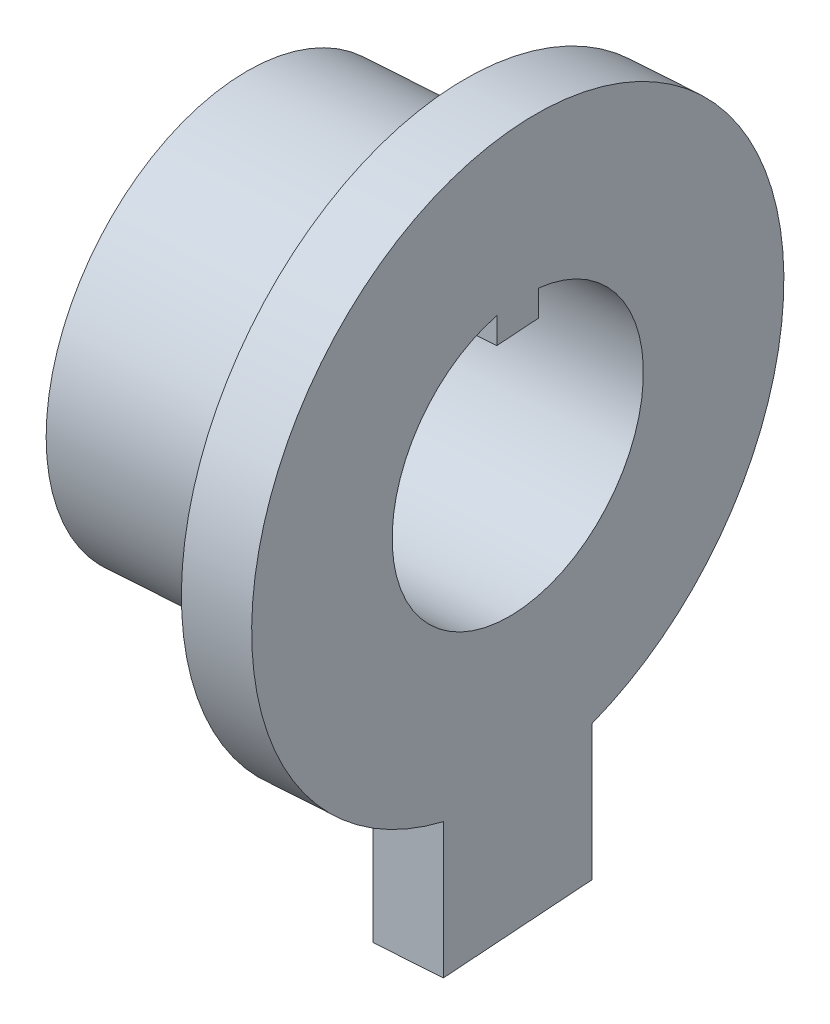
ISO-10303-21;
HEADER;
FILE_DESCRIPTION(('STEP AP214'),'2;1');
FILE_NAME('part.step','',(''),(''),'','','');
FILE_SCHEMA(('AUTOMOTIVE_DESIGN { 1 0 10303 214 1 1 1 1 }'));
ENDSEC;
DATA;
#1=APPLICATION_CONTEXT('core data for automotive mechanical design processes');
#2=APPLICATION_PROTOCOL_DEFINITION('international standard','automotive_design',2000,#1);
#3=PRODUCT_CONTEXT('',#1,'mechanical');
#4=PRODUCT('Part','Part','',(#3));
#5=PRODUCT_RELATED_PRODUCT_CATEGORY('part','',(#4));
#6=PRODUCT_DEFINITION_FORMATION('','',#4);
#7=PRODUCT_DEFINITION_CONTEXT('part definition',#1,'design');
#8=PRODUCT_DEFINITION('design','',#6,#7);
#9=PRODUCT_DEFINITION_SHAPE('','',#8);
#10=(LENGTH_UNIT() NAMED_UNIT(*) SI_UNIT(.MILLI.,.METRE.));
#11=(NAMED_UNIT(*) PLANE_ANGLE_UNIT() SI_UNIT($,.RADIAN.));
#12=(NAMED_UNIT(*) SI_UNIT($,.STERADIAN.) SOLID_ANGLE_UNIT());
#13=UNCERTAINTY_MEASURE_WITH_UNIT(LENGTH_MEASURE(1.E-05),#10,'distance_accuracy_value','');
#14=(GEOMETRIC_REPRESENTATION_CONTEXT(3) GLOBAL_UNCERTAINTY_ASSIGNED_CONTEXT((#13)) GLOBAL_UNIT_ASSIGNED_CONTEXT((#10,
#11,#12)) REPRESENTATION_CONTEXT('',''));
#15=CARTESIAN_POINT('',(0.,0.,0.));
#16=DIRECTION('',(0.,0.,1.));
#17=DIRECTION('',(1.,0.,0.));
#18=AXIS2_PLACEMENT_3D('',#15,#16,#17);
#19=CARTESIAN_POINT('',(-95.6502802586927,72.3954387510304,191.971425065286));
#20=DIRECTION('',(-0.997743585907908,0.,0.0671396811105646));
#21=DIRECTION('',(0.0671396811105646,0.,0.997743585907908));
#22=AXIS2_PLACEMENT_3D('',#19,#20,#21);
#23=PLANE('',#22);
#24=CARTESIAN_POINT('',(-95.6502802586926,72.3954387510304,191.971425065286));
#25=DIRECTION('',(-0.997743585907908,0.,0.0671396811105646));
#26=DIRECTION('',(0.0671396811105646,0.,0.997743585907908));
#27=AXIS2_PLACEMENT_3D('',#24,#25,#26);
#28=CIRCLE('',#27,14.3);
#29=CARTESIAN_POINT('',(-95.3817215342504,58.6662727166348,195.962399408917));
#30=VERTEX_POINT('',#29);
#31=CARTESIAN_POINT('',(-95.9188389831349,58.6662727166348,187.980450721654));
#32=VERTEX_POINT('',#31);
#33=EDGE_CURVE('E45',#30,#32,#28,.T.);
#34=ORIENTED_EDGE('',*,*,#33,.T.);
#35=DIRECTION('',(0.,-1.,0.));
#36=VECTOR('',#35,1.);
#37=CARTESIAN_POINT('',(-95.918838983135,58.6662727166348,187.980450721654));
#38=LINE('',#37,#36);
#39=CARTESIAN_POINT('',(-95.918838983135,51.8954387510304,187.980450721654));
#40=VERTEX_POINT('',#39);
#41=EDGE_CURVE('E120',#32,#40,#38,.T.);
#42=ORIENTED_EDGE('',*,*,#41,.T.);
#43=DIRECTION('',(0.0671396811105646,0.,0.997743585907909));
#44=VECTOR('',#43,1.);
#45=CARTESIAN_POINT('',(-95.918838983135,51.8954387510304,187.980450721654));
#46=LINE('',#45,#44);
#47=CARTESIAN_POINT('',(-95.3817215342504,51.8954387510304,195.962399408917));
#48=VERTEX_POINT('',#47);
#49=EDGE_CURVE('E108',#40,#48,#46,.T.);
#50=ORIENTED_EDGE('',*,*,#49,.T.);
#51=DIRECTION('',(0.,1.,0.));
#52=VECTOR('',#51,1.);
#53=CARTESIAN_POINT('',(-95.3817215342504,51.8954387510304,195.962399408917));
#54=LINE('',#53,#52);
#55=EDGE_CURVE('E114',#48,#30,#54,.T.);
#56=ORIENTED_EDGE('',*,*,#55,.T.);
#57=EDGE_LOOP('',(#34,#42,#50,#56));
#58=FACE_BOUND('',#57,.T.);
#59=CARTESIAN_POINT('',(-95.650280258691,72.3954387510304,191.971425065285));
#60=DIRECTION('',(-0.997743585907908,0.,0.067139681110574));
#61=DIRECTION('',(0.067139681110574,0.,0.997743585907908));
#62=AXIS2_PLACEMENT_3D('',#59,#60,#61);
#63=CIRCLE('',#62,10.125);
#64=CARTESIAN_POINT('',(-94.9704909874465,72.3954387510304,202.073578872603));
#65=VERTEX_POINT('',#64);
#66=EDGE_CURVE('E141',#65,#65,#63,.T.);
#67=ORIENTED_EDGE('',*,*,#66,.F.);
#68=EDGE_LOOP('',(#67));
#69=FACE_BOUND('',#68,.T.);
#70=ADVANCED_FACE('F30',(#58,#69),#23,.T.);
#71=CARTESIAN_POINT('',(-92.6705421973453,72.3954387510304,191.770913965984));
#72=DIRECTION('',(-0.997743585907908,0.,0.0671396811105646));
#73=DIRECTION('',(0.0671396811105646,0.,0.997743585907908));
#74=AXIS2_PLACEMENT_3D('',#71,#72,#73);
#75=CYLINDRICAL_SURFACE('',#74,14.3);
#76=DIRECTION('',(-0.997743585907908,0.,0.0671396811105647));
#77=VECTOR('',#76,1.);
#78=CARTESIAN_POINT('',(-82.1692758313482,58.6662727166348,187.055221736513));
#79=LINE('',#78,#77);
#80=CARTESIAN_POINT('',(-92.6262851496388,58.6662727166348,187.758889773989));
#81=VERTEX_POINT('',#80);
#82=EDGE_CURVE('E50',#81,#32,#79,.T.);
#83=ORIENTED_EDGE('',*,*,#82,.T.);
#84=ORIENTED_EDGE('',*,*,#33,.F.);
#85=DIRECTION('',(-0.997743585907908,0.,0.0671396811105647));
#86=VECTOR('',#85,1.);
#87=CARTESIAN_POINT('',(-81.6321583824637,58.6662727166348,195.037170423776));
#88=LINE('',#87,#86);
#89=CARTESIAN_POINT('',(-92.0891677007543,58.6662727166348,195.740838461252));
#90=VERTEX_POINT('',#89);
#91=EDGE_CURVE('E122',#90,#30,#88,.T.);
#92=ORIENTED_EDGE('',*,*,#91,.F.);
#93=CARTESIAN_POINT('',(-92.3577264251965,72.3954387510304,191.749864117621));
#94=DIRECTION('',(-0.997743585907908,0.,0.0671396811105646));
#95=DIRECTION('',(0.0671396811105646,0.,0.997743585907908));
#96=AXIS2_PLACEMENT_3D('',#93,#94,#95);
#97=CIRCLE('',#96,14.3);
#98=EDGE_CURVE('E154',#90,#81,#97,.T.);
#99=ORIENTED_EDGE('',*,*,#98,.T.);
#100=EDGE_LOOP('',(#83,#84,#92,#99));
#101=FACE_BOUND('',#100,.T.);
#102=ADVANCED_FACE('F32',(#101),#75,.T.);
#103=CARTESIAN_POINT('',(-91.3976289853155,72.3954387510304,206.017597396104));
#104=DIRECTION('',(0.997743585907908,0.,-0.0671396811105646));
#105=DIRECTION('',(-0.0671396811105646,0.,-0.997743585907908));
#106=AXIS2_PLACEMENT_3D('',#103,#104,#105);
#107=PLANE('',#106);
#108=DIRECTION('',(0.0671396811105752,0.,0.997743585907907));
#109=VECTOR('',#108,1.);
#110=CARTESIAN_POINT('',(-92.4332585664443,77.7510285070174,190.627402583474));
#111=LINE('',#110,#109);
#112=CARTESIAN_POINT('',(-92.4332585664443,77.7510285070174,190.627402583474));
#113=VERTEX_POINT('',#112);
#114=CARTESIAN_POINT('',(-92.2821942839472,77.7510285070174,192.872325651767));
#115=VERTEX_POINT('',#114);
#116=EDGE_CURVE('E127',#113,#115,#111,.T.);
#117=ORIENTED_EDGE('',*,*,#116,.F.);
#118=DIRECTION('',(0.,-1.,0.));
#119=VECTOR('',#118,1.);
#120=CARTESIAN_POINT('',(-92.4332585664443,79.0510285070174,190.627402583474));
#121=LINE('',#120,#119);
#122=CARTESIAN_POINT('',(-92.4332585664443,79.0510285070174,190.627402583474));
#123=VERTEX_POINT('',#122);
#124=EDGE_CURVE('E135',#123,#113,#121,.T.);
#125=ORIENTED_EDGE('',*,*,#124,.F.);
#126=CARTESIAN_POINT('',(-92.3577264251949,72.3954387510304,191.74986411762));
#127=DIRECTION('',(0.997743585907908,0.,-0.067139681110574));
#128=DIRECTION('',(-0.067139681110574,0.,-0.997743585907908));
#129=AXIS2_PLACEMENT_3D('',#126,#127,#128);
#130=CIRCLE('',#129,6.75000000000001);
#131=CARTESIAN_POINT('',(-92.2821942839455,79.0510285070174,192.872325651767));
#132=VERTEX_POINT('',#131);
#133=EDGE_CURVE('E132',#132,#123,#130,.T.);
#134=ORIENTED_EDGE('',*,*,#133,.F.);
#135=DIRECTION('',(0.,1.,0.));
#136=VECTOR('',#135,1.);
#137=CARTESIAN_POINT('',(-92.2821942839455,77.7510285070174,192.872325651767));
#138=LINE('',#137,#136);
#139=EDGE_CURVE('E129',#115,#132,#138,.T.);
#140=ORIENTED_EDGE('',*,*,#139,.F.);
#141=EDGE_LOOP('',(#117,#125,#134,#140));
#142=FACE_BOUND('',#141,.T.);
#143=ORIENTED_EDGE('',*,*,#98,.F.);
#144=DIRECTION('',(0.,1.,0.));
#145=VECTOR('',#144,1.);
#146=CARTESIAN_POINT('',(-92.0891677007543,51.8954387510304,195.740838461252));
#147=LINE('',#146,#145);
#148=CARTESIAN_POINT('',(-92.0891677007543,51.8954387510304,195.740838461252));
#149=VERTEX_POINT('',#148);
#150=EDGE_CURVE('E99',#149,#90,#147,.T.);
#151=ORIENTED_EDGE('',*,*,#150,.F.);
#152=DIRECTION('',(0.0671396811105646,0.,0.997743585907908));
#153=VECTOR('',#152,1.);
#154=CARTESIAN_POINT('',(-92.6262851496388,51.8954387510304,187.758889773989));
#155=LINE('',#154,#153);
#156=CARTESIAN_POINT('',(-92.6262851496388,51.8954387510304,187.758889773989));
#157=VERTEX_POINT('',#156);
#158=EDGE_CURVE('E93',#157,#149,#155,.T.);
#159=ORIENTED_EDGE('',*,*,#158,.F.);
#160=DIRECTION('',(0.,-1.,0.));
#161=VECTOR('',#160,1.);
#162=CARTESIAN_POINT('',(-92.6262851496388,58.6662727166348,187.758889773989));
#163=LINE('',#162,#161);
#164=EDGE_CURVE('E97',#81,#157,#163,.T.);
#165=ORIENTED_EDGE('',*,*,#164,.F.);
#166=EDGE_LOOP('',(#143,#151,#159,#165));
#167=FACE_BOUND('',#166,.T.);
#168=ADVANCED_FACE('F95',(#142,#167),#107,.T.);
#169=CARTESIAN_POINT('',(-105.62771611777,72.3954387510304,192.642821876391));
#170=DIRECTION('',(0.997743585907908,0.,-0.067139681110574));
#171=DIRECTION('',(-0.067139681110574,0.,-0.997743585907908));
#172=AXIS2_PLACEMENT_3D('',#169,#170,#171);
#173=CYLINDRICAL_SURFACE('',#172,10.125);
#174=CARTESIAN_POINT('',(-105.62771611777,72.3954387510304,192.642821876391));
#175=DIRECTION('',(-0.997743585907908,0.,0.067139681110574));
#176=DIRECTION('',(0.067139681110574,0.,0.997743585907908));
#177=AXIS2_PLACEMENT_3D('',#174,#175,#176);
#178=CIRCLE('',#177,10.125);
#179=CARTESIAN_POINT('',(-104.947926846526,72.3954387510304,202.744975683709));
#180=VERTEX_POINT('',#179);
#181=EDGE_CURVE('E148',#180,#180,#178,.T.);
#182=ORIENTED_EDGE('',*,*,#181,.F.);
#183=EDGE_LOOP('',(#182));
#184=FACE_BOUND('',#183,.T.);
#185=ORIENTED_EDGE('',*,*,#66,.T.);
#186=EDGE_LOOP('',(#185));
#187=FACE_BOUND('',#186,.T.);
#188=ADVANCED_FACE('F184',(#184,#187),#173,.T.);
#189=CARTESIAN_POINT('',(-105.62771611777,72.3954387510304,192.642821876391));
#190=DIRECTION('',(-0.997743585907908,0.,0.067139681110574));
#191=DIRECTION('',(0.067139681110574,0.,0.997743585907908));
#192=AXIS2_PLACEMENT_3D('',#189,#190,#191);
#193=PLANE('',#192);
#194=DIRECTION('',(-0.067139681110574,0.,-0.997743585907908));
#195=VECTOR('',#194,1.);
#196=CARTESIAN_POINT('',(-105.62771611777,77.7510285070174,192.642821876391));
#197=LINE('',#196,#195);
#198=CARTESIAN_POINT('',(-105.552183976521,77.7510285070174,193.765283410538));
#199=VERTEX_POINT('',#198);
#200=CARTESIAN_POINT('',(-105.703248259019,77.7510285070174,191.520360342245));
#201=VERTEX_POINT('',#200);
#202=EDGE_CURVE('E11',#199,#201,#197,.T.);
#203=ORIENTED_EDGE('',*,*,#202,.F.);
#204=DIRECTION('',(0.,-1.,0.));
#205=VECTOR('',#204,1.);
#206=CARTESIAN_POINT('',(-105.552183976521,72.3954387510304,193.765283410538));
#207=LINE('',#206,#205);
#208=CARTESIAN_POINT('',(-105.552183976521,79.0510285070174,193.765283410538));
#209=VERTEX_POINT('',#208);
#210=EDGE_CURVE('E156',#209,#199,#207,.T.);
#211=ORIENTED_EDGE('',*,*,#210,.F.);
#212=CARTESIAN_POINT('',(-105.62771611777,72.3954387510304,192.642821876391));
#213=DIRECTION('',(-0.997743585907908,0.,0.067139681110574));
#214=DIRECTION('',(0.067139681110574,0.,0.997743585907908));
#215=AXIS2_PLACEMENT_3D('',#212,#213,#214);
#216=CIRCLE('',#215,6.75000000000001);
#217=CARTESIAN_POINT('',(-105.703248259019,79.0510285070174,191.520360342245));
#218=VERTEX_POINT('',#217);
#219=EDGE_CURVE('E158',#218,#209,#216,.T.);
#220=ORIENTED_EDGE('',*,*,#219,.F.);
#221=DIRECTION('',(0.,1.,0.));
#222=VECTOR('',#221,1.);
#223=CARTESIAN_POINT('',(-105.703248259019,72.3954387510303,191.520360342245));
#224=LINE('',#223,#222);
#225=EDGE_CURVE('E38',#201,#218,#224,.T.);
#226=ORIENTED_EDGE('',*,*,#225,.F.);
#227=EDGE_LOOP('',(#203,#211,#220,#226));
#228=FACE_BOUND('',#227,.T.);
#229=ORIENTED_EDGE('',*,*,#181,.T.);
#230=EDGE_LOOP('',(#229));
#231=FACE_BOUND('',#230,.T.);
#232=ADVANCED_FACE('F173',(#228,#231),#193,.T.);
#233=CARTESIAN_POINT('',(-107.290767137915,77.7510285070174,191.627186898478));
#234=DIRECTION('',(0.,1.,0.));
#235=DIRECTION('',(0.,0.,1.));
#236=AXIS2_PLACEMENT_3D('',#233,#234,#235);
#237=PLANE('',#236);
#238=ORIENTED_EDGE('',*,*,#202,.T.);
#239=DIRECTION('',(0.997743585907908,0.,-0.067139681110574));
#240=VECTOR('',#239,1.);
#241=CARTESIAN_POINT('',(-107.290767137915,77.7510285070174,191.627186898478));
#242=LINE('',#241,#240);
#243=EDGE_CURVE('E139',#201,#113,#242,.T.);
#244=ORIENTED_EDGE('',*,*,#243,.T.);
#245=ORIENTED_EDGE('',*,*,#116,.T.);
#246=DIRECTION('',(0.997743585907908,0.,-0.067139681110574));
#247=VECTOR('',#246,1.);
#248=CARTESIAN_POINT('',(-107.139702855416,77.7510285070174,193.87210996677));
#249=LINE('',#248,#247);
#250=EDGE_CURVE('E138',#199,#115,#249,.T.);
#251=ORIENTED_EDGE('',*,*,#250,.F.);
#252=EDGE_LOOP('',(#238,#244,#245,#251));
#253=FACE_BOUND('',#252,.T.);
#254=ADVANCED_FACE('F180',(#253),#237,.F.);
#255=CARTESIAN_POINT('',(-107.290767137915,79.0510285070174,191.627186898478));
#256=DIRECTION('',(0.067139681110574,0.,0.997743585907908));
#257=DIRECTION('',(0.997743585907908,0.,-0.067139681110574));
#258=AXIS2_PLACEMENT_3D('',#255,#256,#257);
#259=PLANE('',#258);
#260=ORIENTED_EDGE('',*,*,#225,.T.);
#261=DIRECTION('',(0.997743585907908,0.,-0.067139681110574));
#262=VECTOR('',#261,1.);
#263=CARTESIAN_POINT('',(-107.290767137915,79.0510285070174,191.627186898478));
#264=LINE('',#263,#262);
#265=EDGE_CURVE('E142',#218,#123,#264,.T.);
#266=ORIENTED_EDGE('',*,*,#265,.T.);
#267=ORIENTED_EDGE('',*,*,#124,.T.);
#268=ORIENTED_EDGE('',*,*,#243,.F.);
#269=EDGE_LOOP('',(#260,#266,#267,#268));
#270=FACE_BOUND('',#269,.T.);
#271=ADVANCED_FACE('F164',(#270),#259,.F.);
#272=CARTESIAN_POINT('',(-107.215234996665,72.3954387510304,192.749648432624));
#273=DIRECTION('',(0.997743585907908,0.,-0.067139681110574));
#274=DIRECTION('',(-0.067139681110574,0.,-0.997743585907908));
#275=AXIS2_PLACEMENT_3D('',#272,#273,#274);
#276=CYLINDRICAL_SURFACE('',#275,6.75000000000001);
#277=ORIENTED_EDGE('',*,*,#219,.T.);
#278=DIRECTION('',(0.997743585907908,0.,-0.067139681110574));
#279=VECTOR('',#278,1.);
#280=CARTESIAN_POINT('',(-107.139702855416,79.0510285070174,193.87210996677));
#281=LINE('',#280,#279);
#282=EDGE_CURVE('E144',#209,#132,#281,.T.);
#283=ORIENTED_EDGE('',*,*,#282,.T.);
#284=ORIENTED_EDGE('',*,*,#133,.T.);
#285=ORIENTED_EDGE('',*,*,#265,.F.);
#286=EDGE_LOOP('',(#277,#283,#284,#285));
#287=FACE_BOUND('',#286,.T.);
#288=ADVANCED_FACE('F169',(#287),#276,.F.);
#289=CARTESIAN_POINT('',(-107.139702855416,77.7510285070174,193.87210996677));
#290=DIRECTION('',(-0.067139681110574,0.,-0.997743585907908));
#291=DIRECTION('',(-0.997743585907908,0.,0.067139681110574));
#292=AXIS2_PLACEMENT_3D('',#289,#290,#291);
#293=PLANE('',#292);
#294=ORIENTED_EDGE('',*,*,#210,.T.);
#295=ORIENTED_EDGE('',*,*,#250,.T.);
#296=ORIENTED_EDGE('',*,*,#139,.T.);
#297=ORIENTED_EDGE('',*,*,#282,.F.);
#298=EDGE_LOOP('',(#294,#295,#296,#297));
#299=FACE_BOUND('',#298,.T.);
#300=ADVANCED_FACE('F177',(#299),#293,.F.);
#301=CARTESIAN_POINT('',(-82.1692758313482,58.6662727166348,187.055221736513));
#302=DIRECTION('',(-0.0671396811105647,0.,-0.997743585907908));
#303=DIRECTION('',(-0.997743585907908,0.,0.0671396811105647));
#304=AXIS2_PLACEMENT_3D('',#301,#302,#303);
#305=PLANE('',#304);
#306=ORIENTED_EDGE('',*,*,#82,.F.);
#307=ORIENTED_EDGE('',*,*,#164,.T.);
#308=DIRECTION('',(-0.997743585907908,0.,0.0671396811105647));
#309=VECTOR('',#308,1.);
#310=CARTESIAN_POINT('',(-82.1692758313482,51.8954387510304,187.055221736513));
#311=LINE('',#310,#309);
#312=EDGE_CURVE('E103',#157,#40,#311,.T.);
#313=ORIENTED_EDGE('',*,*,#312,.T.);
#314=ORIENTED_EDGE('',*,*,#41,.F.);
#315=EDGE_LOOP('',(#306,#307,#313,#314));
#316=FACE_BOUND('',#315,.T.);
#317=ADVANCED_FACE('F113',(#316),#305,.T.);
#318=CARTESIAN_POINT('',(-82.1692758313482,51.8954387510304,187.055221736513));
#319=DIRECTION('',(0.,-1.,0.));
#320=DIRECTION('',(0.,0.,-1.));
#321=AXIS2_PLACEMENT_3D('',#318,#319,#320);
#322=PLANE('',#321);
#323=ORIENTED_EDGE('',*,*,#312,.F.);
#324=ORIENTED_EDGE('',*,*,#158,.T.);
#325=DIRECTION('',(-0.997743585907908,0.,0.0671396811105647));
#326=VECTOR('',#325,1.);
#327=CARTESIAN_POINT('',(-81.6321583824637,51.8954387510304,195.037170423776));
#328=LINE('',#327,#326);
#329=EDGE_CURVE('E102',#149,#48,#328,.T.);
#330=ORIENTED_EDGE('',*,*,#329,.T.);
#331=ORIENTED_EDGE('',*,*,#49,.F.);
#332=EDGE_LOOP('',(#323,#324,#330,#331));
#333=FACE_BOUND('',#332,.T.);
#334=ADVANCED_FACE('F106',(#333),#322,.T.);
#335=CARTESIAN_POINT('',(-81.6321583824637,51.8954387510304,195.037170423776));
#336=DIRECTION('',(0.0671396811105647,0.,0.997743585907908));
#337=DIRECTION('',(0.997743585907908,0.,-0.0671396811105647));
#338=AXIS2_PLACEMENT_3D('',#335,#336,#337);
#339=PLANE('',#338);
#340=ORIENTED_EDGE('',*,*,#329,.F.);
#341=ORIENTED_EDGE('',*,*,#150,.T.);
#342=ORIENTED_EDGE('',*,*,#91,.T.);
#343=ORIENTED_EDGE('',*,*,#55,.F.);
#344=EDGE_LOOP('',(#340,#341,#342,#343));
#345=FACE_BOUND('',#344,.T.);
#346=ADVANCED_FACE('F212',(#345),#339,.T.);
#347=CLOSED_SHELL('',(#70,#102,#168,#188,#232,#254,#271,#288,#300,#317,#334,#346));
#348=MANIFOLD_SOLID_BREP('B2',#347);
#349=ADVANCED_BREP_SHAPE_REPRESENTATION('',(#18,#348),#14);
#350=SHAPE_DEFINITION_REPRESENTATION(#9,#349);
ENDSEC;
END-ISO-10303-21;
